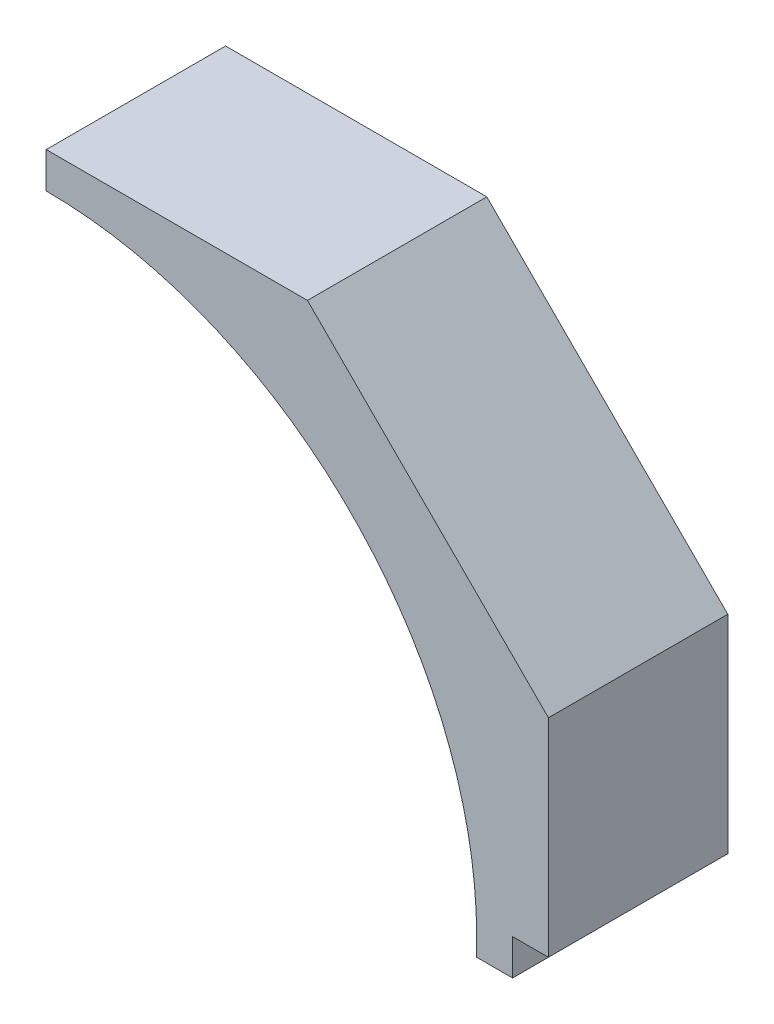
ISO-10303-21;
HEADER;
FILE_DESCRIPTION(('STEP AP214'),'2;1');
FILE_NAME('part.step','',(''),(''),'','','');
FILE_SCHEMA(('AUTOMOTIVE_DESIGN { 1 0 10303 214 1 1 1 1 }'));
ENDSEC;
DATA;
#1=APPLICATION_CONTEXT('core data for automotive mechanical design processes');
#2=APPLICATION_PROTOCOL_DEFINITION('international standard','automotive_design',2000,#1);
#3=PRODUCT_CONTEXT('',#1,'mechanical');
#4=PRODUCT('Part','Part','',(#3));
#5=PRODUCT_RELATED_PRODUCT_CATEGORY('part','',(#4));
#6=PRODUCT_DEFINITION_FORMATION('','',#4);
#7=PRODUCT_DEFINITION_CONTEXT('part definition',#1,'design');
#8=PRODUCT_DEFINITION('design','',#6,#7);
#9=PRODUCT_DEFINITION_SHAPE('','',#8);
#10=(LENGTH_UNIT() NAMED_UNIT(*) SI_UNIT(.MILLI.,.METRE.));
#11=(NAMED_UNIT(*) PLANE_ANGLE_UNIT() SI_UNIT($,.RADIAN.));
#12=(NAMED_UNIT(*) SI_UNIT($,.STERADIAN.) SOLID_ANGLE_UNIT());
#13=UNCERTAINTY_MEASURE_WITH_UNIT(LENGTH_MEASURE(1.E-05),#10,'distance_accuracy_value','');
#14=(GEOMETRIC_REPRESENTATION_CONTEXT(3) GLOBAL_UNCERTAINTY_ASSIGNED_CONTEXT((#13)) GLOBAL_UNIT_ASSIGNED_CONTEXT((#10,
#11,#12)) REPRESENTATION_CONTEXT('',''));
#15=CARTESIAN_POINT('',(0.,0.,0.));
#16=DIRECTION('',(0.,0.,1.));
#17=DIRECTION('',(1.,0.,0.));
#18=AXIS2_PLACEMENT_3D('',#15,#16,#17);
#19=CARTESIAN_POINT('',(0.,0.,12.7));
#20=DIRECTION('',(0.,0.,-1.));
#21=DIRECTION('',(-1.,0.,0.));
#22=AXIS2_PLACEMENT_3D('',#19,#20,#21);
#23=CYLINDRICAL_SURFACE('',#22,30.4800000000001);
#24=CARTESIAN_POINT('',(0.,0.,0.));
#25=DIRECTION('',(0.,0.,-1.));
#26=DIRECTION('',(-1.,0.,0.));
#27=AXIS2_PLACEMENT_3D('',#24,#25,#26);
#28=CIRCLE('',#27,30.4800000000001);
#29=CARTESIAN_POINT('',(0.,30.4800000000001,0.));
#30=VERTEX_POINT('',#29);
#31=CARTESIAN_POINT('',(30.4800000000001,0.,0.));
#32=VERTEX_POINT('',#31);
#33=EDGE_CURVE('E147',#30,#32,#28,.T.);
#34=ORIENTED_EDGE('',*,*,#33,.T.);
#35=DIRECTION('',(0.,0.,-1.));
#36=VECTOR('',#35,1.);
#37=CARTESIAN_POINT('',(30.4800000000001,0.,12.7));
#38=LINE('',#37,#36);
#39=CARTESIAN_POINT('',(30.4800000000001,0.,12.7));
#40=VERTEX_POINT('',#39);
#41=EDGE_CURVE('E47',#40,#32,#38,.T.);
#42=ORIENTED_EDGE('',*,*,#41,.F.);
#43=CARTESIAN_POINT('',(0.,0.,12.7));
#44=DIRECTION('',(0.,0.,-1.));
#45=DIRECTION('',(-1.,0.,0.));
#46=AXIS2_PLACEMENT_3D('',#43,#44,#45);
#47=CIRCLE('',#46,30.4800000000001);
#48=CARTESIAN_POINT('',(0.,30.4800000000001,12.7));
#49=VERTEX_POINT('',#48);
#50=EDGE_CURVE('E148',#49,#40,#47,.T.);
#51=ORIENTED_EDGE('',*,*,#50,.F.);
#52=DIRECTION('',(0.,0.,-1.));
#53=VECTOR('',#52,1.);
#54=CARTESIAN_POINT('',(0.,30.4800000000001,12.7));
#55=LINE('',#54,#53);
#56=EDGE_CURVE('E169',#49,#30,#55,.T.);
#57=ORIENTED_EDGE('',*,*,#56,.T.);
#58=EDGE_LOOP('',(#34,#42,#51,#57));
#59=FACE_BOUND('',#58,.T.);
#60=ADVANCED_FACE('F39',(#59),#23,.F.);
#61=CARTESIAN_POINT('',(30.4800000000001,0.,12.7));
#62=DIRECTION('',(1.,0.,0.));
#63=DIRECTION('',(0.,0.,-1.));
#64=AXIS2_PLACEMENT_3D('',#61,#62,#63);
#65=PLANE('',#64);
#66=DIRECTION('',(0.,-1.,0.));
#67=VECTOR('',#66,1.);
#68=CARTESIAN_POINT('',(30.4800000000001,0.,0.));
#69=LINE('',#68,#67);
#70=CARTESIAN_POINT('',(30.4800000000001,-1.27,0.));
#71=VERTEX_POINT('',#70);
#72=EDGE_CURVE('E173',#32,#71,#69,.T.);
#73=ORIENTED_EDGE('',*,*,#72,.T.);
#74=DIRECTION('',(0.,0.,-1.));
#75=VECTOR('',#74,1.);
#76=CARTESIAN_POINT('',(30.4800000000001,-1.27,12.7));
#77=LINE('',#76,#75);
#78=CARTESIAN_POINT('',(30.4800000000001,-1.27,12.7));
#79=VERTEX_POINT('',#78);
#80=EDGE_CURVE('E199',#79,#71,#77,.T.);
#81=ORIENTED_EDGE('',*,*,#80,.F.);
#82=DIRECTION('',(0.,-1.,0.));
#83=VECTOR('',#82,1.);
#84=CARTESIAN_POINT('',(30.4800000000001,0.,12.7));
#85=LINE('',#84,#83);
#86=EDGE_CURVE('E152',#40,#79,#85,.T.);
#87=ORIENTED_EDGE('',*,*,#86,.F.);
#88=ORIENTED_EDGE('',*,*,#41,.T.);
#89=EDGE_LOOP('',(#73,#81,#87,#88));
#90=FACE_BOUND('',#89,.T.);
#91=ADVANCED_FACE('F206',(#90),#65,.F.);
#92=CARTESIAN_POINT('',(38.1,-1.27,12.7));
#93=DIRECTION('',(0.,1.,0.));
#94=DIRECTION('',(-1.,0.,0.));
#95=AXIS2_PLACEMENT_3D('',#92,#93,#94);
#96=PLANE('',#95);
#97=DIRECTION('',(1.,0.,0.));
#98=VECTOR('',#97,1.);
#99=CARTESIAN_POINT('',(38.1,-1.27,0.));
#100=LINE('',#99,#98);
#101=CARTESIAN_POINT('',(33.0200000000001,-1.27,0.));
#102=VERTEX_POINT('',#101);
#103=EDGE_CURVE('E177',#71,#102,#100,.T.);
#104=ORIENTED_EDGE('',*,*,#103,.T.);
#105=DIRECTION('',(0.,0.,1.));
#106=VECTOR('',#105,1.);
#107=CARTESIAN_POINT('',(33.0200000000001,-1.27,0.));
#108=LINE('',#107,#106);
#109=CARTESIAN_POINT('',(33.0200000000001,-1.27,12.7));
#110=VERTEX_POINT('',#109);
#111=EDGE_CURVE('E61',#102,#110,#108,.T.);
#112=ORIENTED_EDGE('',*,*,#111,.T.);
#113=DIRECTION('',(1.,0.,0.));
#114=VECTOR('',#113,1.);
#115=CARTESIAN_POINT('',(30.4800000000001,-1.27,12.7));
#116=LINE('',#115,#114);
#117=EDGE_CURVE('E156',#79,#110,#116,.T.);
#118=ORIENTED_EDGE('',*,*,#117,.F.);
#119=ORIENTED_EDGE('',*,*,#80,.T.);
#120=EDGE_LOOP('',(#104,#112,#118,#119));
#121=FACE_BOUND('',#120,.T.);
#122=ADVANCED_FACE('F214',(#121),#96,.F.);
#123=CARTESIAN_POINT('',(18.4975133699687,33.0200000000001,12.7));
#124=DIRECTION('',(-0.707106781186549,-0.707106781186545,0.));
#125=DIRECTION('',(0.707106781186545,-0.70710678118655,0.));
#126=AXIS2_PLACEMENT_3D('',#123,#124,#125);
#127=PLANE('',#126);
#128=DIRECTION('',(-0.707106781186546,0.70710678118655,0.));
#129=VECTOR('',#128,1.);
#130=CARTESIAN_POINT('',(18.4975133699687,33.0200000000001,12.7));
#131=LINE('',#130,#129);
#132=CARTESIAN_POINT('',(35.5600000000001,15.9575133699687,12.7));
#133=VERTEX_POINT('',#132);
#134=CARTESIAN_POINT('',(18.4975133699687,33.0200000000001,12.7));
#135=VERTEX_POINT('',#134);
#136=EDGE_CURVE('E160',#133,#135,#131,.T.);
#137=ORIENTED_EDGE('',*,*,#136,.F.);
#138=DIRECTION('',(0.,0.,1.));
#139=VECTOR('',#138,1.);
#140=CARTESIAN_POINT('',(35.5600000000001,15.9575133699687,-17.4137536709479));
#141=LINE('',#140,#139);
#142=CARTESIAN_POINT('',(35.5600000000001,15.9575133699687,0.));
#143=VERTEX_POINT('',#142);
#144=EDGE_CURVE('E121',#143,#133,#141,.T.);
#145=ORIENTED_EDGE('',*,*,#144,.F.);
#146=DIRECTION('',(-0.707106781186546,0.70710678118655,0.));
#147=VECTOR('',#146,1.);
#148=CARTESIAN_POINT('',(18.4975133699687,33.0200000000001,0.));
#149=LINE('',#148,#147);
#150=CARTESIAN_POINT('',(18.4975133699687,33.0200000000001,0.));
#151=VERTEX_POINT('',#150);
#152=EDGE_CURVE('E116',#143,#151,#149,.T.);
#153=ORIENTED_EDGE('',*,*,#152,.T.);
#154=DIRECTION('',(0.,0.,-1.));
#155=VECTOR('',#154,1.);
#156=CARTESIAN_POINT('',(18.4975133699687,33.0200000000001,12.7));
#157=LINE('',#156,#155);
#158=EDGE_CURVE('E195',#135,#151,#157,.T.);
#159=ORIENTED_EDGE('',*,*,#158,.F.);
#160=EDGE_LOOP('',(#137,#145,#153,#159));
#161=FACE_BOUND('',#160,.T.);
#162=ADVANCED_FACE('F228',(#161),#127,.F.);
#163=CARTESIAN_POINT('',(0.,33.0200000000001,12.7));
#164=DIRECTION('',(0.,-1.,0.));
#165=DIRECTION('',(1.,0.,0.));
#166=AXIS2_PLACEMENT_3D('',#163,#164,#165);
#167=PLANE('',#166);
#168=DIRECTION('',(-1.,0.,0.));
#169=VECTOR('',#168,1.);
#170=CARTESIAN_POINT('',(0.,33.0200000000001,0.));
#171=LINE('',#170,#169);
#172=CARTESIAN_POINT('',(0.,33.0200000000001,0.));
#173=VERTEX_POINT('',#172);
#174=EDGE_CURVE('E183',#151,#173,#171,.T.);
#175=ORIENTED_EDGE('',*,*,#174,.T.);
#176=DIRECTION('',(0.,0.,-1.));
#177=VECTOR('',#176,1.);
#178=CARTESIAN_POINT('',(0.,33.0200000000001,12.7));
#179=LINE('',#178,#177);
#180=CARTESIAN_POINT('',(0.,33.0200000000001,12.7));
#181=VERTEX_POINT('',#180);
#182=EDGE_CURVE('E191',#181,#173,#179,.T.);
#183=ORIENTED_EDGE('',*,*,#182,.F.);
#184=DIRECTION('',(-1.,0.,0.));
#185=VECTOR('',#184,1.);
#186=CARTESIAN_POINT('',(0.,33.0200000000001,12.7));
#187=LINE('',#186,#185);
#188=EDGE_CURVE('E163',#135,#181,#187,.T.);
#189=ORIENTED_EDGE('',*,*,#188,.F.);
#190=ORIENTED_EDGE('',*,*,#158,.T.);
#191=EDGE_LOOP('',(#175,#183,#189,#190));
#192=FACE_BOUND('',#191,.T.);
#193=ADVANCED_FACE('F225',(#192),#167,.F.);
#194=CARTESIAN_POINT('',(0.,30.4800000000001,12.7));
#195=DIRECTION('',(1.,0.,0.));
#196=DIRECTION('',(0.,0.,-1.));
#197=AXIS2_PLACEMENT_3D('',#194,#195,#196);
#198=PLANE('',#197);
#199=DIRECTION('',(0.,-1.,0.));
#200=VECTOR('',#199,1.);
#201=CARTESIAN_POINT('',(0.,30.4800000000001,0.));
#202=LINE('',#201,#200);
#203=EDGE_CURVE('E153',#173,#30,#202,.T.);
#204=ORIENTED_EDGE('',*,*,#203,.T.);
#205=ORIENTED_EDGE('',*,*,#56,.F.);
#206=DIRECTION('',(0.,-1.,0.));
#207=VECTOR('',#206,1.);
#208=CARTESIAN_POINT('',(0.,30.4800000000001,12.7));
#209=LINE('',#208,#207);
#210=EDGE_CURVE('E166',#181,#49,#209,.T.);
#211=ORIENTED_EDGE('',*,*,#210,.F.);
#212=ORIENTED_EDGE('',*,*,#182,.T.);
#213=EDGE_LOOP('',(#204,#205,#211,#212));
#214=FACE_BOUND('',#213,.T.);
#215=ADVANCED_FACE('F223',(#214),#198,.F.);
#216=CARTESIAN_POINT('',(0.,0.,12.7));
#217=DIRECTION('',(0.,0.,-1.));
#218=DIRECTION('',(-1.,0.,0.));
#219=AXIS2_PLACEMENT_3D('',#216,#217,#218);
#220=PLANE('',#219);
#221=ORIENTED_EDGE('',*,*,#117,.T.);
#222=DIRECTION('',(0.,-1.,0.));
#223=VECTOR('',#222,1.);
#224=CARTESIAN_POINT('',(33.0200000000001,-1.27,12.7));
#225=LINE('',#224,#223);
#226=CARTESIAN_POINT('',(33.0200000000001,1.27,12.7));
#227=VERTEX_POINT('',#226);
#228=EDGE_CURVE('E142',#227,#110,#225,.T.);
#229=ORIENTED_EDGE('',*,*,#228,.F.);
#230=DIRECTION('',(1.,0.,0.));
#231=VECTOR('',#230,1.);
#232=CARTESIAN_POINT('',(33.0200000000001,1.27,12.7));
#233=LINE('',#232,#231);
#234=CARTESIAN_POINT('',(35.5600000000001,1.27,12.7));
#235=VERTEX_POINT('',#234);
#236=EDGE_CURVE('E54',#227,#235,#233,.T.);
#237=ORIENTED_EDGE('',*,*,#236,.T.);
#238=DIRECTION('',(0.,1.,0.));
#239=VECTOR('',#238,1.);
#240=CARTESIAN_POINT('',(35.5600000000001,1.27,12.7));
#241=LINE('',#240,#239);
#242=EDGE_CURVE('E127',#235,#133,#241,.T.);
#243=ORIENTED_EDGE('',*,*,#242,.T.);
#244=ORIENTED_EDGE('',*,*,#136,.T.);
#245=ORIENTED_EDGE('',*,*,#188,.T.);
#246=ORIENTED_EDGE('',*,*,#210,.T.);
#247=ORIENTED_EDGE('',*,*,#50,.T.);
#248=ORIENTED_EDGE('',*,*,#86,.T.);
#249=EDGE_LOOP('',(#221,#229,#237,#243,#244,#245,#246,#247,#248));
#250=FACE_BOUND('',#249,.T.);
#251=ADVANCED_FACE('F218',(#250),#220,.F.);
#252=CARTESIAN_POINT('',(0.,0.,0.));
#253=DIRECTION('',(0.,0.,-1.));
#254=DIRECTION('',(-1.,0.,0.));
#255=AXIS2_PLACEMENT_3D('',#252,#253,#254);
#256=PLANE('',#255);
#257=DIRECTION('',(0.,1.,0.));
#258=VECTOR('',#257,1.);
#259=CARTESIAN_POINT('',(33.0200000000001,0.,0.));
#260=LINE('',#259,#258);
#261=CARTESIAN_POINT('',(33.0200000000001,1.27,0.));
#262=VERTEX_POINT('',#261);
#263=EDGE_CURVE('E11',#102,#262,#260,.T.);
#264=ORIENTED_EDGE('',*,*,#263,.F.);
#265=ORIENTED_EDGE('',*,*,#103,.F.);
#266=ORIENTED_EDGE('',*,*,#72,.F.);
#267=ORIENTED_EDGE('',*,*,#33,.F.);
#268=ORIENTED_EDGE('',*,*,#203,.F.);
#269=ORIENTED_EDGE('',*,*,#174,.F.);
#270=ORIENTED_EDGE('',*,*,#152,.F.);
#271=DIRECTION('',(0.,1.,0.));
#272=VECTOR('',#271,1.);
#273=CARTESIAN_POINT('',(35.5600000000001,1.27,0.));
#274=LINE('',#273,#272);
#275=CARTESIAN_POINT('',(35.5600000000001,1.27,0.));
#276=VERTEX_POINT('',#275);
#277=EDGE_CURVE('E110',#276,#143,#274,.T.);
#278=ORIENTED_EDGE('',*,*,#277,.F.);
#279=DIRECTION('',(1.,0.,0.));
#280=VECTOR('',#279,1.);
#281=CARTESIAN_POINT('',(33.0200000000001,1.27,0.));
#282=LINE('',#281,#280);
#283=EDGE_CURVE('E114',#262,#276,#282,.T.);
#284=ORIENTED_EDGE('',*,*,#283,.F.);
#285=EDGE_LOOP('',(#264,#265,#266,#267,#268,#269,#270,#278,#284));
#286=FACE_BOUND('',#285,.T.);
#287=ADVANCED_FACE('F112',(#286),#256,.T.);
#288=CARTESIAN_POINT('',(33.0200000000001,-1.27,0.));
#289=DIRECTION('',(-1.,0.,0.));
#290=DIRECTION('',(0.,0.,1.));
#291=AXIS2_PLACEMENT_3D('',#288,#289,#290);
#292=PLANE('',#291);
#293=ORIENTED_EDGE('',*,*,#263,.T.);
#294=DIRECTION('',(0.,0.,1.));
#295=VECTOR('',#294,1.);
#296=CARTESIAN_POINT('',(33.0200000000001,1.27,-17.4137536709479));
#297=LINE('',#296,#295);
#298=EDGE_CURVE('E131',#262,#227,#297,.T.);
#299=ORIENTED_EDGE('',*,*,#298,.T.);
#300=ORIENTED_EDGE('',*,*,#228,.T.);
#301=ORIENTED_EDGE('',*,*,#111,.F.);
#302=EDGE_LOOP('',(#293,#299,#300,#301));
#303=FACE_BOUND('',#302,.T.);
#304=ADVANCED_FACE('F284',(#303),#292,.F.);
#305=CARTESIAN_POINT('',(33.0200000000001,1.27,-17.4137536709479));
#306=DIRECTION('',(0.,-1.,0.));
#307=DIRECTION('',(1.,0.,0.));
#308=AXIS2_PLACEMENT_3D('',#305,#306,#307);
#309=PLANE('',#308);
#310=ORIENTED_EDGE('',*,*,#298,.F.);
#311=ORIENTED_EDGE('',*,*,#283,.T.);
#312=DIRECTION('',(0.,0.,1.));
#313=VECTOR('',#312,1.);
#314=CARTESIAN_POINT('',(35.5600000000001,1.27,-17.4137536709479));
#315=LINE('',#314,#313);
#316=EDGE_CURVE('E122',#276,#235,#315,.T.);
#317=ORIENTED_EDGE('',*,*,#316,.T.);
#318=ORIENTED_EDGE('',*,*,#236,.F.);
#319=EDGE_LOOP('',(#310,#311,#317,#318));
#320=FACE_BOUND('',#319,.T.);
#321=ADVANCED_FACE('F130',(#320),#309,.T.);
#322=CARTESIAN_POINT('',(35.5600000000001,1.27,-17.4137536709479));
#323=DIRECTION('',(1.,0.,0.));
#324=DIRECTION('',(0.,0.,-1.));
#325=AXIS2_PLACEMENT_3D('',#322,#323,#324);
#326=PLANE('',#325);
#327=ORIENTED_EDGE('',*,*,#316,.F.);
#328=ORIENTED_EDGE('',*,*,#277,.T.);
#329=ORIENTED_EDGE('',*,*,#144,.T.);
#330=ORIENTED_EDGE('',*,*,#242,.F.);
#331=EDGE_LOOP('',(#327,#328,#329,#330));
#332=FACE_BOUND('',#331,.T.);
#333=ADVANCED_FACE('F125',(#332),#326,.T.);
#334=CLOSED_SHELL('',(#60,#91,#122,#162,#193,#215,#251,#287,#304,#321,#333));
#335=MANIFOLD_SOLID_BREP('B2',#334);
#336=ADVANCED_BREP_SHAPE_REPRESENTATION('',(#18,#335),#14);
#337=SHAPE_DEFINITION_REPRESENTATION(#9,#336);
ENDSEC;
END-ISO-10303-21;
